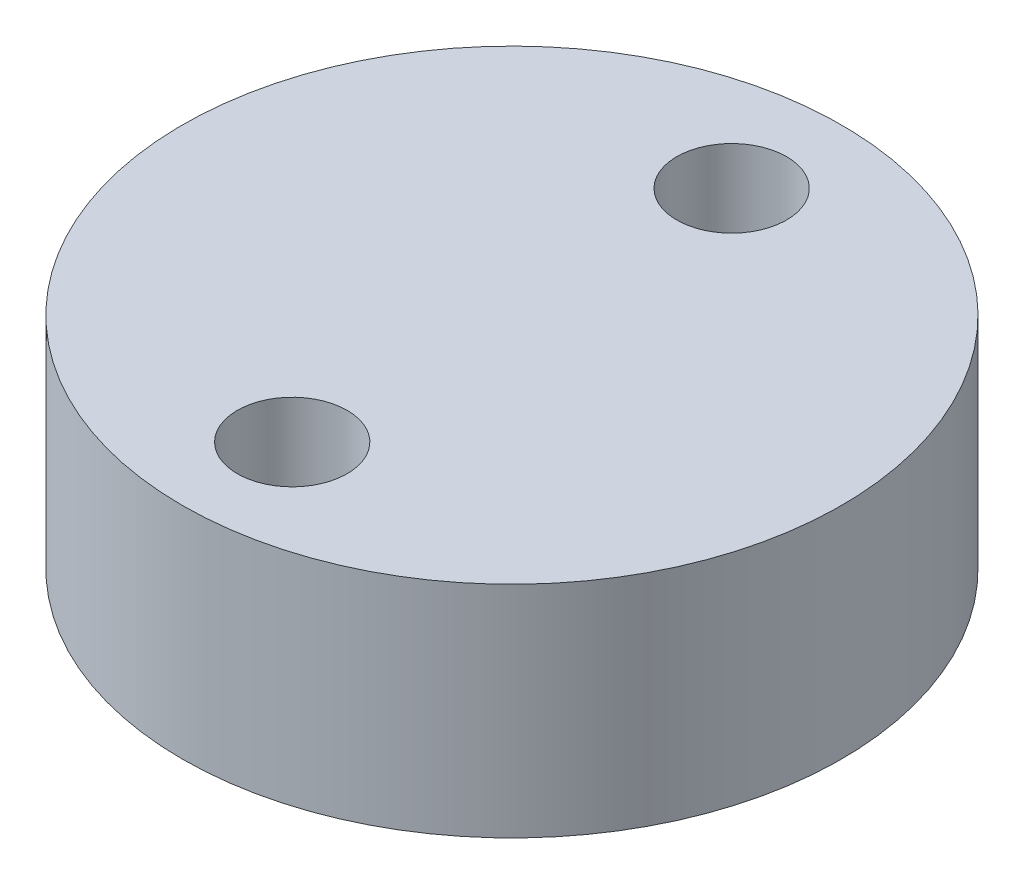
ISO-10303-21;
HEADER;
FILE_DESCRIPTION(('STEP AP214'),'2;1');
FILE_NAME('part.step','',(''),(''),'','','');
FILE_SCHEMA(('AUTOMOTIVE_DESIGN { 1 0 10303 214 1 1 1 1 }'));
ENDSEC;
DATA;
#1=APPLICATION_CONTEXT('core data for automotive mechanical design processes');
#2=APPLICATION_PROTOCOL_DEFINITION('international standard','automotive_design',2000,#1);
#3=PRODUCT_CONTEXT('',#1,'mechanical');
#4=PRODUCT('Part','Part','',(#3));
#5=PRODUCT_RELATED_PRODUCT_CATEGORY('part','',(#4));
#6=PRODUCT_DEFINITION_FORMATION('','',#4);
#7=PRODUCT_DEFINITION_CONTEXT('part definition',#1,'design');
#8=PRODUCT_DEFINITION('design','',#6,#7);
#9=PRODUCT_DEFINITION_SHAPE('','',#8);
#10=(LENGTH_UNIT() NAMED_UNIT(*) SI_UNIT(.MILLI.,.METRE.));
#11=(NAMED_UNIT(*) PLANE_ANGLE_UNIT() SI_UNIT($,.RADIAN.));
#12=(NAMED_UNIT(*) SI_UNIT($,.STERADIAN.) SOLID_ANGLE_UNIT());
#13=UNCERTAINTY_MEASURE_WITH_UNIT(LENGTH_MEASURE(1.E-05),#10,'distance_accuracy_value','');
#14=(GEOMETRIC_REPRESENTATION_CONTEXT(3) GLOBAL_UNCERTAINTY_ASSIGNED_CONTEXT((#13)) GLOBAL_UNIT_ASSIGNED_CONTEXT((#10,
#11,#12)) REPRESENTATION_CONTEXT('',''));
#15=CARTESIAN_POINT('',(0.,0.,0.));
#16=DIRECTION('',(0.,0.,1.));
#17=DIRECTION('',(1.,0.,0.));
#18=AXIS2_PLACEMENT_3D('',#15,#16,#17);
#19=CARTESIAN_POINT('',(0.,0.,0.));
#20=DIRECTION('',(0.,1.,0.));
#21=DIRECTION('',(0.,0.,1.));
#22=AXIS2_PLACEMENT_3D('',#19,#20,#21);
#23=PLANE('',#22);
#24=CARTESIAN_POINT('',(0.,0.,12.7));
#25=DIRECTION('',(0.,-1.,0.));
#26=DIRECTION('',(0.,0.,-1.));
#27=AXIS2_PLACEMENT_3D('',#24,#25,#26);
#28=CIRCLE('',#27,3.175);
#29=CARTESIAN_POINT('',(0.,0.,9.525));
#30=VERTEX_POINT('',#29);
#31=EDGE_CURVE('E137',#30,#30,#28,.T.);
#32=ORIENTED_EDGE('',*,*,#31,.F.);
#33=EDGE_LOOP('',(#32));
#34=FACE_BOUND('',#33,.T.);
#35=CARTESIAN_POINT('',(0.,0.,-12.7));
#36=DIRECTION('',(0.,-1.,0.));
#37=DIRECTION('',(0.,0.,-1.));
#38=AXIS2_PLACEMENT_3D('',#35,#36,#37);
#39=CIRCLE('',#38,3.175);
#40=CARTESIAN_POINT('',(0.,0.,-15.875));
#41=VERTEX_POINT('',#40);
#42=EDGE_CURVE('E141',#41,#41,#39,.T.);
#43=ORIENTED_EDGE('',*,*,#42,.F.);
#44=EDGE_LOOP('',(#43));
#45=FACE_BOUND('',#44,.T.);
#46=DIRECTION('',(-1.,0.,0.));
#47=VECTOR('',#46,1.);
#48=CARTESIAN_POINT('',(16.5847265060177,0.,6.47656891797643));
#49=LINE('',#48,#47);
#50=CARTESIAN_POINT('',(16.5847265060177,0.,6.47656891797643));
#51=VERTEX_POINT('',#50);
#52=CARTESIAN_POINT('',(3.63072650601772,0.,6.47656891797643));
#53=VERTEX_POINT('',#52);
#54=EDGE_CURVE('E79',#51,#53,#49,.T.);
#55=ORIENTED_EDGE('',*,*,#54,.F.);
#56=DIRECTION('',(-0.0115372095224727,0.,-0.999933444183379));
#57=VECTOR('',#56,1.);
#58=CARTESIAN_POINT('',(16.5078024000691,0.,-0.190466651708719));
#59=LINE('',#58,#57);
#60=CARTESIAN_POINT('',(16.4352734939823,0.,-6.47656891797643));
#61=VERTEX_POINT('',#60);
#62=EDGE_CURVE('E92',#51,#61,#59,.T.);
#63=ORIENTED_EDGE('',*,*,#62,.T.);
#64=DIRECTION('',(-1.,0.,0.));
#65=VECTOR('',#64,1.);
#66=CARTESIAN_POINT('',(16.4352734939823,0.,-6.47656891797643));
#67=LINE('',#66,#65);
#68=CARTESIAN_POINT('',(3.48127349398228,0.,-6.47656891797643));
#69=VERTEX_POINT('',#68);
#70=EDGE_CURVE('E97',#69,#61,#67,.F.);
#71=ORIENTED_EDGE('',*,*,#70,.F.);
#72=DIRECTION('',(-0.0115372095224727,0.,-0.999933444183379));
#73=VECTOR('',#72,1.);
#74=CARTESIAN_POINT('',(3.55552667078412,0.,-0.0410235865218778));
#75=LINE('',#74,#73);
#76=EDGE_CURVE('E95',#53,#69,#75,.T.);
#77=ORIENTED_EDGE('',*,*,#76,.F.);
#78=EDGE_LOOP('',(#55,#63,#71,#77));
#79=FACE_BOUND('',#78,.T.);
#80=CARTESIAN_POINT('',(0.,0.,0.));
#81=DIRECTION('',(0.,1.,0.));
#82=DIRECTION('',(0.,0.,1.));
#83=AXIS2_PLACEMENT_3D('',#80,#81,#82);
#84=CIRCLE('',#83,19.05);
#85=CARTESIAN_POINT('',(0.,0.,19.05));
#86=VERTEX_POINT('',#85);
#87=EDGE_CURVE('E100',#86,#86,#84,.T.);
#88=ORIENTED_EDGE('',*,*,#87,.F.);
#89=EDGE_LOOP('',(#88));
#90=FACE_BOUND('',#89,.T.);
#91=DIRECTION('',(0.,0.,1.));
#92=VECTOR('',#91,1.);
#93=CARTESIAN_POINT('',(-3.55599999999999,0.,0.));
#94=LINE('',#93,#92);
#95=CARTESIAN_POINT('',(-3.556,0.,-6.477));
#96=VERTEX_POINT('',#95);
#97=CARTESIAN_POINT('',(-3.556,0.,6.477));
#98=VERTEX_POINT('',#97);
#99=EDGE_CURVE('E12',#96,#98,#94,.T.);
#100=ORIENTED_EDGE('',*,*,#99,.F.);
#101=DIRECTION('',(1.,0.,0.));
#102=VECTOR('',#101,1.);
#103=CARTESIAN_POINT('',(-16.51,0.,-6.477));
#104=LINE('',#103,#102);
#105=CARTESIAN_POINT('',(-16.764,0.,-6.477));
#106=VERTEX_POINT('',#105);
#107=EDGE_CURVE('E78',#106,#96,#104,.T.);
#108=ORIENTED_EDGE('',*,*,#107,.F.);
#109=DIRECTION('',(0.,0.,1.));
#110=VECTOR('',#109,1.);
#111=CARTESIAN_POINT('',(-16.764,0.,0.));
#112=LINE('',#111,#110);
#113=CARTESIAN_POINT('',(-16.764,0.,6.477));
#114=VERTEX_POINT('',#113);
#115=EDGE_CURVE('E73',#106,#114,#112,.T.);
#116=ORIENTED_EDGE('',*,*,#115,.T.);
#117=DIRECTION('',(1.,0.,0.));
#118=VECTOR('',#117,1.);
#119=CARTESIAN_POINT('',(-16.51,0.,6.477));
#120=LINE('',#119,#118);
#121=EDGE_CURVE('E43',#98,#114,#120,.F.);
#122=ORIENTED_EDGE('',*,*,#121,.F.);
#123=EDGE_LOOP('',(#100,#108,#116,#122));
#124=FACE_BOUND('',#123,.T.);
#125=ADVANCED_FACE('F35',(#34,#45,#79,#90,#124),#23,.F.);
#126=CARTESIAN_POINT('',(0.,12.7,0.));
#127=DIRECTION('',(0.,-1.,0.));
#128=DIRECTION('',(0.,0.,-1.));
#129=AXIS2_PLACEMENT_3D('',#126,#127,#128);
#130=CYLINDRICAL_SURFACE('',#129,19.05);
#131=CARTESIAN_POINT('',(0.,12.7,0.));
#132=DIRECTION('',(0.,1.,0.));
#133=DIRECTION('',(0.,0.,1.));
#134=AXIS2_PLACEMENT_3D('',#131,#132,#133);
#135=CIRCLE('',#134,19.05);
#136=CARTESIAN_POINT('',(0.,12.7,19.05));
#137=VERTEX_POINT('',#136);
#138=EDGE_CURVE('E99',#137,#137,#135,.T.);
#139=ORIENTED_EDGE('',*,*,#138,.F.);
#140=EDGE_LOOP('',(#139));
#141=FACE_BOUND('',#140,.T.);
#142=ORIENTED_EDGE('',*,*,#87,.T.);
#143=EDGE_LOOP('',(#142));
#144=FACE_BOUND('',#143,.T.);
#145=ADVANCED_FACE('F37',(#141,#144),#130,.T.);
#146=CARTESIAN_POINT('',(0.,12.7,0.));
#147=DIRECTION('',(0.,1.,0.));
#148=DIRECTION('',(0.,0.,1.));
#149=AXIS2_PLACEMENT_3D('',#146,#147,#148);
#150=PLANE('',#149);
#151=CARTESIAN_POINT('',(0.,12.7,12.7));
#152=DIRECTION('',(0.,-1.,0.));
#153=DIRECTION('',(0.,0.,-1.));
#154=AXIS2_PLACEMENT_3D('',#151,#152,#153);
#155=CIRCLE('',#154,3.175);
#156=CARTESIAN_POINT('',(0.,12.7,9.525));
#157=VERTEX_POINT('',#156);
#158=EDGE_CURVE('E150',#157,#157,#155,.T.);
#159=ORIENTED_EDGE('',*,*,#158,.T.);
#160=EDGE_LOOP('',(#159));
#161=FACE_BOUND('',#160,.T.);
#162=CARTESIAN_POINT('',(0.,12.7,-12.7));
#163=DIRECTION('',(0.,-1.,0.));
#164=DIRECTION('',(0.,0.,-1.));
#165=AXIS2_PLACEMENT_3D('',#162,#163,#164);
#166=CIRCLE('',#165,3.175);
#167=CARTESIAN_POINT('',(0.,12.7,-15.875));
#168=VERTEX_POINT('',#167);
#169=EDGE_CURVE('E86',#168,#168,#166,.T.);
#170=ORIENTED_EDGE('',*,*,#169,.T.);
#171=EDGE_LOOP('',(#170));
#172=FACE_BOUND('',#171,.T.);
#173=ORIENTED_EDGE('',*,*,#138,.T.);
#174=EDGE_LOOP('',(#173));
#175=FACE_BOUND('',#174,.T.);
#176=ADVANCED_FACE('F124',(#161,#172,#175),#150,.T.);
#177=CARTESIAN_POINT('',(16.1957545984158,0.000906439087676437,-27.235744147039));
#178=DIRECTION('',(0.999933444183379,0.,-0.0115372095224727));
#179=DIRECTION('',(-0.0115372095224727,0.,-0.999933444183379));
#180=AXIS2_PLACEMENT_3D('',#177,#178,#179);
#181=PLANE('',#180);
#182=CARTESIAN_POINT('',(16.51,0.,0.));
#183=DIRECTION('',(0.999933444183485,0.,-0.0115372095133121));
#184=DIRECTION('',(-0.0115372095133121,0.,-0.999933444183485));
#185=AXIS2_PLACEMENT_3D('',#182,#183,#184);
#186=CIRCLE('',#185,6.477);
#187=EDGE_CURVE('E106',#61,#51,#186,.T.);
#188=ORIENTED_EDGE('',*,*,#187,.F.);
#189=ORIENTED_EDGE('',*,*,#62,.F.);
#190=EDGE_LOOP('',(#188,#189));
#191=FACE_BOUND('',#190,.T.);
#192=ADVANCED_FACE('F120',(#191),#181,.F.);
#193=CARTESIAN_POINT('',(3.24175459841583,0.000906439087676437,-27.235744147039));
#194=DIRECTION('',(0.999933444183379,0.,-0.0115372095224727));
#195=DIRECTION('',(-0.0115372095224727,0.,-0.999933444183379));
#196=AXIS2_PLACEMENT_3D('',#193,#194,#195);
#197=PLANE('',#196);
#198=ORIENTED_EDGE('',*,*,#76,.T.);
#199=CARTESIAN_POINT('',(3.556,0.,0.));
#200=DIRECTION('',(0.999933444183485,0.,-0.0115372095133121));
#201=DIRECTION('',(-0.0115372095133121,0.,-0.999933444183485));
#202=AXIS2_PLACEMENT_3D('',#199,#200,#201);
#203=CIRCLE('',#202,6.477);
#204=EDGE_CURVE('E57',#69,#53,#203,.T.);
#205=ORIENTED_EDGE('',*,*,#204,.T.);
#206=EDGE_LOOP('',(#198,#205));
#207=FACE_BOUND('',#206,.T.);
#208=ADVANCED_FACE('F116',(#207),#197,.T.);
#209=DIRECTION('',(-1.,0.,0.));
#210=VECTOR('',#209,1.);
#211=SURFACE_OF_LINEAR_EXTRUSION('',#186,#210);
#212=ORIENTED_EDGE('',*,*,#54,.T.);
#213=ORIENTED_EDGE('',*,*,#204,.F.);
#214=ORIENTED_EDGE('',*,*,#70,.T.);
#215=ORIENTED_EDGE('',*,*,#187,.T.);
#216=EDGE_LOOP('',(#212,#213,#214,#215));
#217=FACE_BOUND('',#216,.T.);
#218=ADVANCED_FACE('F111',(#217),#211,.T.);
#219=CARTESIAN_POINT('',(-3.55599999999999,-27.2375569799683,0.));
#220=DIRECTION('',(-1.,0.,0.));
#221=DIRECTION('',(0.,0.,1.));
#222=AXIS2_PLACEMENT_3D('',#219,#220,#221);
#223=PLANE('',#222);
#224=ORIENTED_EDGE('',*,*,#99,.T.);
#225=CARTESIAN_POINT('',(-3.556,0.,0.));
#226=DIRECTION('',(-1.,0.,0.));
#227=DIRECTION('',(0.,0.,1.));
#228=AXIS2_PLACEMENT_3D('',#225,#226,#227);
#229=CIRCLE('',#228,6.477);
#230=EDGE_CURVE('E85',#98,#96,#229,.T.);
#231=ORIENTED_EDGE('',*,*,#230,.T.);
#232=EDGE_LOOP('',(#224,#231));
#233=FACE_BOUND('',#232,.T.);
#234=ADVANCED_FACE('F115',(#233),#223,.T.);
#235=CARTESIAN_POINT('',(-16.51,0.,0.));
#236=DIRECTION('',(1.,0.,0.));
#237=DIRECTION('',(0.,0.,-1.));
#238=AXIS2_PLACEMENT_3D('',#235,#236,#237);
#239=CYLINDRICAL_SURFACE('',#238,6.477);
#240=ORIENTED_EDGE('',*,*,#121,.T.);
#241=CARTESIAN_POINT('',(-16.764,0.,0.));
#242=DIRECTION('',(-1.,0.,0.));
#243=DIRECTION('',(0.,0.,1.));
#244=AXIS2_PLACEMENT_3D('',#241,#242,#243);
#245=CIRCLE('',#244,6.477);
#246=EDGE_CURVE('E49',#114,#106,#245,.T.);
#247=ORIENTED_EDGE('',*,*,#246,.T.);
#248=ORIENTED_EDGE('',*,*,#107,.T.);
#249=ORIENTED_EDGE('',*,*,#230,.F.);
#250=EDGE_LOOP('',(#240,#247,#248,#249));
#251=FACE_BOUND('',#250,.T.);
#252=ADVANCED_FACE('F82',(#251),#239,.F.);
#253=CARTESIAN_POINT('',(-16.764,-27.2375569799683,0.));
#254=DIRECTION('',(-1.,0.,0.));
#255=DIRECTION('',(0.,0.,1.));
#256=AXIS2_PLACEMENT_3D('',#253,#254,#255);
#257=PLANE('',#256);
#258=ORIENTED_EDGE('',*,*,#246,.F.);
#259=ORIENTED_EDGE('',*,*,#115,.F.);
#260=EDGE_LOOP('',(#258,#259));
#261=FACE_BOUND('',#260,.T.);
#262=ADVANCED_FACE('F74',(#261),#257,.F.);
#263=CARTESIAN_POINT('',(0.,12.7,-12.7));
#264=DIRECTION('',(0.,-1.,0.));
#265=DIRECTION('',(0.,0.,-1.));
#266=AXIS2_PLACEMENT_3D('',#263,#264,#265);
#267=CYLINDRICAL_SURFACE('',#266,3.175);
#268=ORIENTED_EDGE('',*,*,#169,.F.);
#269=EDGE_LOOP('',(#268));
#270=FACE_BOUND('',#269,.T.);
#271=ORIENTED_EDGE('',*,*,#42,.T.);
#272=EDGE_LOOP('',(#271));
#273=FACE_BOUND('',#272,.T.);
#274=ADVANCED_FACE('F160',(#270,#273),#267,.F.);
#275=CARTESIAN_POINT('',(0.,12.7,12.7));
#276=DIRECTION('',(0.,-1.,0.));
#277=DIRECTION('',(0.,0.,-1.));
#278=AXIS2_PLACEMENT_3D('',#275,#276,#277);
#279=CYLINDRICAL_SURFACE('',#278,3.175);
#280=ORIENTED_EDGE('',*,*,#158,.F.);
#281=EDGE_LOOP('',(#280));
#282=FACE_BOUND('',#281,.T.);
#283=ORIENTED_EDGE('',*,*,#31,.T.);
#284=EDGE_LOOP('',(#283));
#285=FACE_BOUND('',#284,.T.);
#286=ADVANCED_FACE('F158',(#282,#285),#279,.F.);
#287=CLOSED_SHELL('',(#125,#145,#176,#192,#208,#218,#234,#252,#262,#274,#286));
#288=MANIFOLD_SOLID_BREP('B2',#287);
#289=ADVANCED_BREP_SHAPE_REPRESENTATION('',(#18,#288),#14);
#290=SHAPE_DEFINITION_REPRESENTATION(#9,#289);
ENDSEC;
END-ISO-10303-21;
